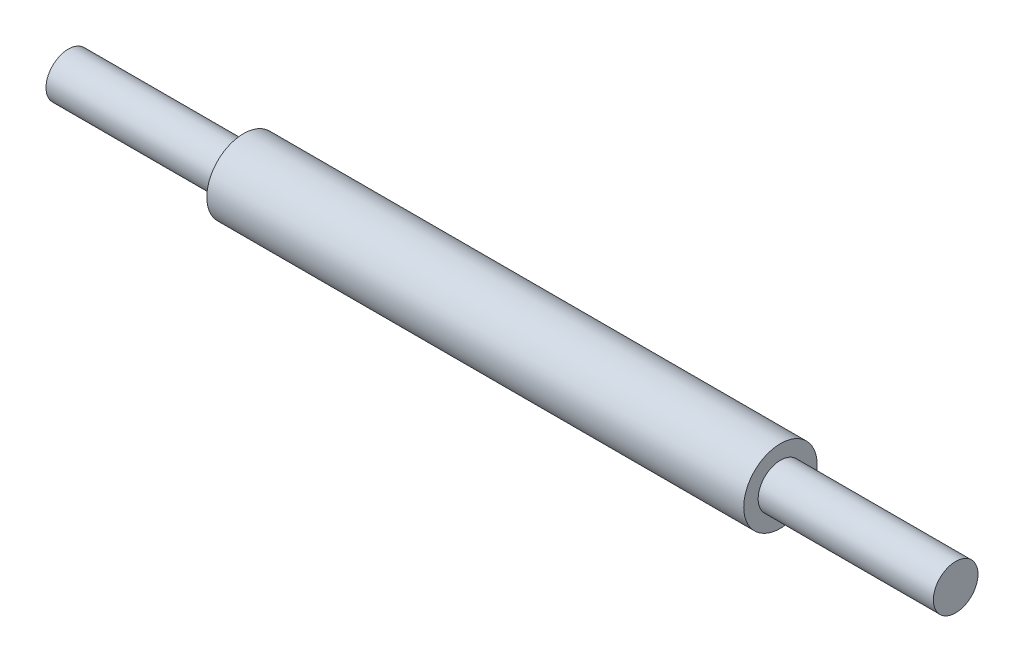
ISO-10303-21;
HEADER;
FILE_DESCRIPTION(('STEP AP214'),'2;1');
FILE_NAME('part.step','',(''),(''),'','','');
FILE_SCHEMA(('AUTOMOTIVE_DESIGN { 1 0 10303 214 1 1 1 1 }'));
ENDSEC;
DATA;
#1=APPLICATION_CONTEXT('core data for automotive mechanical design processes');
#2=APPLICATION_PROTOCOL_DEFINITION('international standard','automotive_design',2000,#1);
#3=PRODUCT_CONTEXT('',#1,'mechanical');
#4=PRODUCT('Part','Part','',(#3));
#5=PRODUCT_RELATED_PRODUCT_CATEGORY('part','',(#4));
#6=PRODUCT_DEFINITION_FORMATION('','',#4);
#7=PRODUCT_DEFINITION_CONTEXT('part definition',#1,'design');
#8=PRODUCT_DEFINITION('design','',#6,#7);
#9=PRODUCT_DEFINITION_SHAPE('','',#8);
#10=(LENGTH_UNIT() NAMED_UNIT(*) SI_UNIT(.MILLI.,.METRE.));
#11=(NAMED_UNIT(*) PLANE_ANGLE_UNIT() SI_UNIT($,.RADIAN.));
#12=(NAMED_UNIT(*) SI_UNIT($,.STERADIAN.) SOLID_ANGLE_UNIT());
#13=UNCERTAINTY_MEASURE_WITH_UNIT(LENGTH_MEASURE(1.E-05),#10,'distance_accuracy_value','');
#14=(GEOMETRIC_REPRESENTATION_CONTEXT(3) GLOBAL_UNCERTAINTY_ASSIGNED_CONTEXT((#13)) GLOBAL_UNIT_ASSIGNED_CONTEXT((#10,
#11,#12)) REPRESENTATION_CONTEXT('',''));
#15=CARTESIAN_POINT('',(0.,0.,0.));
#16=DIRECTION('',(0.,0.,1.));
#17=DIRECTION('',(1.,0.,0.));
#18=AXIS2_PLACEMENT_3D('',#15,#16,#17);
#19=CARTESIAN_POINT('',(-95.,0.,0.));
#20=DIRECTION('',(-1.,0.,0.));
#21=DIRECTION('',(0.,0.,1.));
#22=AXIS2_PLACEMENT_3D('',#19,#20,#21);
#23=PLANE('',#22);
#24=CARTESIAN_POINT('',(-95.,0.,0.));
#25=DIRECTION('',(-1.,0.,0.));
#26=DIRECTION('',(0.,0.,1.));
#27=AXIS2_PLACEMENT_3D('',#24,#25,#26);
#28=CIRCLE('',#27,6.5);
#29=CARTESIAN_POINT('',(-95.,0.,6.5));
#30=VERTEX_POINT('',#29);
#31=EDGE_CURVE('E42',#30,#30,#28,.T.);
#32=ORIENTED_EDGE('',*,*,#31,.T.);
#33=EDGE_LOOP('',(#32));
#34=FACE_BOUND('',#33,.T.);
#35=CARTESIAN_POINT('',(-95.,0.,0.));
#36=DIRECTION('',(-1.,0.,0.));
#37=DIRECTION('',(0.,0.,1.));
#38=AXIS2_PLACEMENT_3D('',#35,#36,#37);
#39=CIRCLE('',#38,3.95);
#40=CARTESIAN_POINT('',(-95.,0.,3.95));
#41=VERTEX_POINT('',#40);
#42=EDGE_CURVE('E52',#41,#41,#39,.T.);
#43=ORIENTED_EDGE('',*,*,#42,.F.);
#44=EDGE_LOOP('',(#43));
#45=FACE_BOUND('',#44,.T.);
#46=ADVANCED_FACE('F31',(#34,#45),#23,.T.);
#47=CARTESIAN_POINT('',(31.,0.,0.));
#48=DIRECTION('',(-1.,0.,0.));
#49=DIRECTION('',(0.,0.,1.));
#50=AXIS2_PLACEMENT_3D('',#47,#48,#49);
#51=CYLINDRICAL_SURFACE('',#50,3.95);
#52=CARTESIAN_POINT('',(31.,0.,0.));
#53=DIRECTION('',(1.,0.,0.));
#54=DIRECTION('',(0.,0.,-1.));
#55=AXIS2_PLACEMENT_3D('',#52,#53,#54);
#56=CIRCLE('',#55,3.95);
#57=CARTESIAN_POINT('',(31.,0.,-3.95));
#58=VERTEX_POINT('',#57);
#59=EDGE_CURVE('E10',#58,#58,#56,.T.);
#60=ORIENTED_EDGE('',*,*,#59,.F.);
#61=EDGE_LOOP('',(#60));
#62=FACE_BOUND('',#61,.T.);
#63=CARTESIAN_POINT('',(0.,0.,0.));
#64=DIRECTION('',(-1.,0.,0.));
#65=DIRECTION('',(0.,0.,1.));
#66=AXIS2_PLACEMENT_3D('',#63,#64,#65);
#67=CIRCLE('',#66,3.95);
#68=CARTESIAN_POINT('',(0.,0.,3.95));
#69=VERTEX_POINT('',#68);
#70=EDGE_CURVE('E38',#69,#69,#67,.T.);
#71=ORIENTED_EDGE('',*,*,#70,.F.);
#72=EDGE_LOOP('',(#71));
#73=FACE_BOUND('',#72,.T.);
#74=ADVANCED_FACE('F33',(#62,#73),#51,.T.);
#75=CARTESIAN_POINT('',(31.,0.,0.));
#76=DIRECTION('',(1.,0.,0.));
#77=DIRECTION('',(0.,0.,-1.));
#78=AXIS2_PLACEMENT_3D('',#75,#76,#77);
#79=PLANE('',#78);
#80=ORIENTED_EDGE('',*,*,#59,.T.);
#81=EDGE_LOOP('',(#80));
#82=FACE_BOUND('',#81,.T.);
#83=ADVANCED_FACE('F73',(#82),#79,.T.);
#84=CARTESIAN_POINT('',(0.,0.,0.));
#85=DIRECTION('',(-1.,0.,0.));
#86=DIRECTION('',(0.,0.,1.));
#87=AXIS2_PLACEMENT_3D('',#84,#85,#86);
#88=PLANE('',#87);
#89=CARTESIAN_POINT('',(0.,0.,0.));
#90=DIRECTION('',(-1.,0.,0.));
#91=DIRECTION('',(0.,0.,1.));
#92=AXIS2_PLACEMENT_3D('',#89,#90,#91);
#93=CIRCLE('',#92,6.5);
#94=CARTESIAN_POINT('',(0.,0.,6.5));
#95=VERTEX_POINT('',#94);
#96=EDGE_CURVE('E46',#95,#95,#93,.T.);
#97=ORIENTED_EDGE('',*,*,#96,.F.);
#98=EDGE_LOOP('',(#97));
#99=FACE_BOUND('',#98,.T.);
#100=ORIENTED_EDGE('',*,*,#70,.T.);
#101=EDGE_LOOP('',(#100));
#102=FACE_BOUND('',#101,.T.);
#103=ADVANCED_FACE('F77',(#99,#102),#88,.F.);
#104=CARTESIAN_POINT('',(-95.,0.,0.));
#105=DIRECTION('',(1.,0.,0.));
#106=DIRECTION('',(0.,0.,-1.));
#107=AXIS2_PLACEMENT_3D('',#104,#105,#106);
#108=CYLINDRICAL_SURFACE('',#107,6.5);
#109=ORIENTED_EDGE('',*,*,#31,.F.);
#110=EDGE_LOOP('',(#109));
#111=FACE_BOUND('',#110,.T.);
#112=ORIENTED_EDGE('',*,*,#96,.T.);
#113=EDGE_LOOP('',(#112));
#114=FACE_BOUND('',#113,.T.);
#115=ADVANCED_FACE('F63',(#111,#114),#108,.T.);
#116=CARTESIAN_POINT('',(-126.,0.,0.));
#117=DIRECTION('',(1.,0.,0.));
#118=DIRECTION('',(0.,0.,-1.));
#119=AXIS2_PLACEMENT_3D('',#116,#117,#118);
#120=CYLINDRICAL_SURFACE('',#119,3.95);
#121=CARTESIAN_POINT('',(-126.,0.,0.));
#122=DIRECTION('',(-1.,0.,0.));
#123=DIRECTION('',(0.,0.,1.));
#124=AXIS2_PLACEMENT_3D('',#121,#122,#123);
#125=CIRCLE('',#124,3.95);
#126=CARTESIAN_POINT('',(-126.,0.,3.95));
#127=VERTEX_POINT('',#126);
#128=EDGE_CURVE('E50',#127,#127,#125,.T.);
#129=ORIENTED_EDGE('',*,*,#128,.F.);
#130=EDGE_LOOP('',(#129));
#131=FACE_BOUND('',#130,.T.);
#132=ORIENTED_EDGE('',*,*,#42,.T.);
#133=EDGE_LOOP('',(#132));
#134=FACE_BOUND('',#133,.T.);
#135=ADVANCED_FACE('F60',(#131,#134),#120,.T.);
#136=CARTESIAN_POINT('',(-126.,0.,0.));
#137=DIRECTION('',(-1.,0.,0.));
#138=DIRECTION('',(0.,0.,1.));
#139=AXIS2_PLACEMENT_3D('',#136,#137,#138);
#140=PLANE('',#139);
#141=ORIENTED_EDGE('',*,*,#128,.T.);
#142=EDGE_LOOP('',(#141));
#143=FACE_BOUND('',#142,.T.);
#144=ADVANCED_FACE('F58',(#143),#140,.T.);
#145=CLOSED_SHELL('',(#46,#74,#83,#103,#115,#135,#144));
#146=MANIFOLD_SOLID_BREP('B2',#145);
#147=ADVANCED_BREP_SHAPE_REPRESENTATION('',(#18,#146),#14);
#148=SHAPE_DEFINITION_REPRESENTATION(#9,#147);
ENDSEC;
END-ISO-10303-21;
